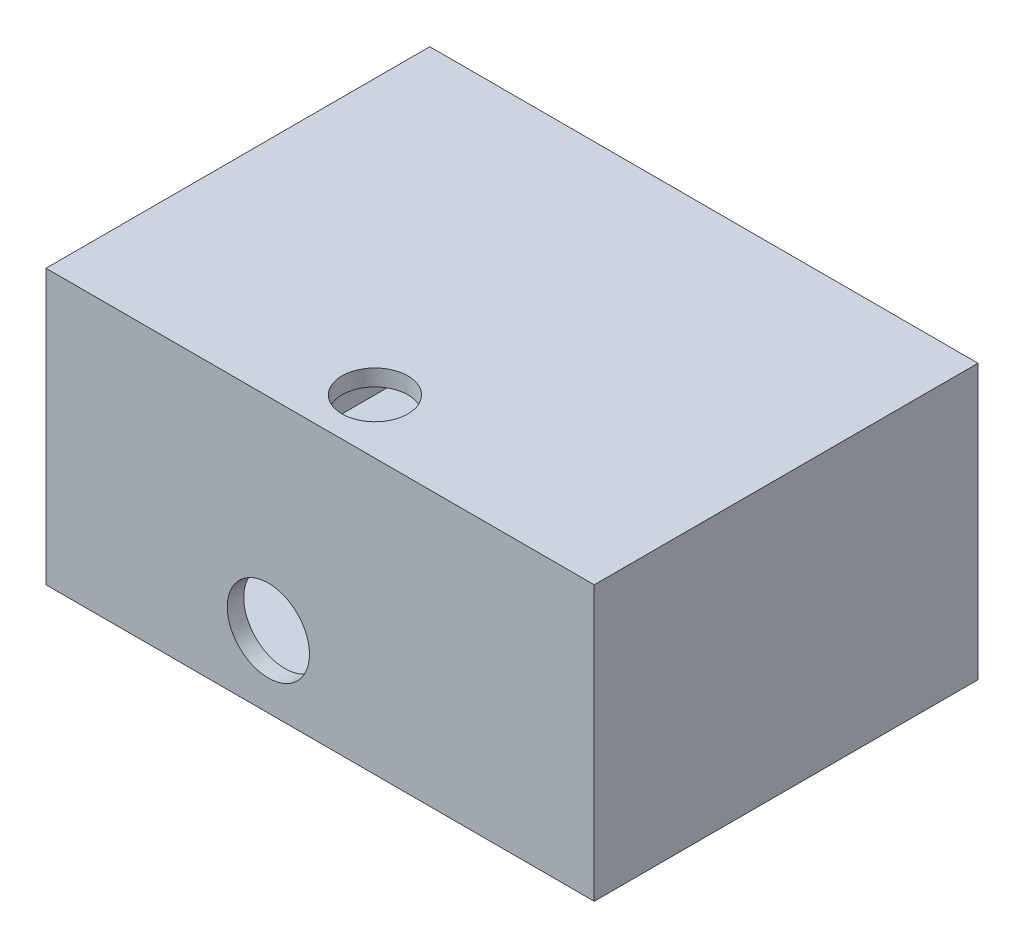
ISO-10303-21;
HEADER;
FILE_DESCRIPTION(('STEP AP214'),'2;1');
FILE_NAME('part.step','',(''),(''),'','','');
FILE_SCHEMA(('AUTOMOTIVE_DESIGN { 1 0 10303 214 1 1 1 1 }'));
ENDSEC;
DATA;
#1=APPLICATION_CONTEXT('core data for automotive mechanical design processes');
#2=APPLICATION_PROTOCOL_DEFINITION('international standard','automotive_design',2000,#1);
#3=PRODUCT_CONTEXT('',#1,'mechanical');
#4=PRODUCT('Part','Part','',(#3));
#5=PRODUCT_RELATED_PRODUCT_CATEGORY('part','',(#4));
#6=PRODUCT_DEFINITION_FORMATION('','',#4);
#7=PRODUCT_DEFINITION_CONTEXT('part definition',#1,'design');
#8=PRODUCT_DEFINITION('design','',#6,#7);
#9=PRODUCT_DEFINITION_SHAPE('','',#8);
#10=(LENGTH_UNIT() NAMED_UNIT(*) SI_UNIT(.MILLI.,.METRE.));
#11=(NAMED_UNIT(*) PLANE_ANGLE_UNIT() SI_UNIT($,.RADIAN.));
#12=(NAMED_UNIT(*) SI_UNIT($,.STERADIAN.) SOLID_ANGLE_UNIT());
#13=UNCERTAINTY_MEASURE_WITH_UNIT(LENGTH_MEASURE(1.E-05),#10,'distance_accuracy_value','');
#14=(GEOMETRIC_REPRESENTATION_CONTEXT(3) GLOBAL_UNCERTAINTY_ASSIGNED_CONTEXT((#13)) GLOBAL_UNIT_ASSIGNED_CONTEXT((#10,
#11,#12)) REPRESENTATION_CONTEXT('',''));
#15=CARTESIAN_POINT('',(0.,0.,0.));
#16=DIRECTION('',(0.,0.,1.));
#17=DIRECTION('',(1.,0.,0.));
#18=AXIS2_PLACEMENT_3D('',#15,#16,#17);
#19=CARTESIAN_POINT('',(-50.,-22.,70.));
#20=DIRECTION('',(0.,1.,0.));
#21=DIRECTION('',(0.,0.,1.));
#22=AXIS2_PLACEMENT_3D('',#19,#20,#21);
#23=PLANE('',#22);
#24=DIRECTION('',(1.,0.,0.));
#25=VECTOR('',#24,1.);
#26=CARTESIAN_POINT('',(-50.,-22.,3.));
#27=LINE('',#26,#25);
#28=CARTESIAN_POINT('',(-47.,-22.,3.));
#29=VERTEX_POINT('',#28);
#30=CARTESIAN_POINT('',(47.,-22.,3.));
#31=VERTEX_POINT('',#30);
#32=EDGE_CURVE('E143',#29,#31,#27,.T.);
#33=ORIENTED_EDGE('',*,*,#32,.F.);
#34=DIRECTION('',(0.,0.,-1.));
#35=VECTOR('',#34,1.);
#36=CARTESIAN_POINT('',(-47.,-22.,70.));
#37=LINE('',#36,#35);
#38=CARTESIAN_POINT('',(-47.,-22.,67.));
#39=VERTEX_POINT('',#38);
#40=EDGE_CURVE('E164',#39,#29,#37,.T.);
#41=ORIENTED_EDGE('',*,*,#40,.F.);
#42=DIRECTION('',(1.,0.,0.));
#43=VECTOR('',#42,1.);
#44=CARTESIAN_POINT('',(-50.,-22.,67.));
#45=LINE('',#44,#43);
#46=CARTESIAN_POINT('',(47.,-22.,67.));
#47=VERTEX_POINT('',#46);
#48=EDGE_CURVE('E135',#39,#47,#45,.T.);
#49=ORIENTED_EDGE('',*,*,#48,.T.);
#50=DIRECTION('',(0.,0.,-1.));
#51=VECTOR('',#50,1.);
#52=CARTESIAN_POINT('',(47.,-22.,70.));
#53=LINE('',#52,#51);
#54=EDGE_CURVE('E141',#47,#31,#53,.T.);
#55=ORIENTED_EDGE('',*,*,#54,.T.);
#56=EDGE_LOOP('',(#33,#41,#49,#55));
#57=FACE_BOUND('',#56,.T.);
#58=ADVANCED_FACE('F41',(#57),#23,.T.);
#59=CARTESIAN_POINT('',(0.,0.,67.));
#60=DIRECTION('',(0.,0.,1.));
#61=DIRECTION('',(1.,0.,0.));
#62=AXIS2_PLACEMENT_3D('',#59,#60,#61);
#63=PLANE('',#62);
#64=CARTESIAN_POINT('',(-9.44,-11.95,67.));
#65=DIRECTION('',(0.,0.,1.));
#66=DIRECTION('',(1.,0.,0.));
#67=AXIS2_PLACEMENT_3D('',#64,#65,#66);
#68=CIRCLE('',#67,7.5);
#69=CARTESIAN_POINT('',(-1.94,-11.95,67.));
#70=VERTEX_POINT('',#69);
#71=EDGE_CURVE('E263',#70,#70,#68,.T.);
#72=ORIENTED_EDGE('',*,*,#71,.T.);
#73=EDGE_LOOP('',(#72));
#74=FACE_BOUND('',#73,.T.);
#75=DIRECTION('',(-1.,0.,0.));
#76=VECTOR('',#75,1.);
#77=CARTESIAN_POINT('',(50.,22.,67.));
#78=LINE('',#77,#76);
#79=CARTESIAN_POINT('',(47.,22.,67.));
#80=VERTEX_POINT('',#79);
#81=CARTESIAN_POINT('',(-47.,22.,67.));
#82=VERTEX_POINT('',#81);
#83=EDGE_CURVE('E114',#80,#82,#78,.T.);
#84=ORIENTED_EDGE('',*,*,#83,.F.);
#85=DIRECTION('',(0.,1.,0.));
#86=VECTOR('',#85,1.);
#87=CARTESIAN_POINT('',(47.,25.,67.));
#88=LINE('',#87,#86);
#89=EDGE_CURVE('E137',#47,#80,#88,.T.);
#90=ORIENTED_EDGE('',*,*,#89,.F.);
#91=ORIENTED_EDGE('',*,*,#48,.F.);
#92=DIRECTION('',(0.,-1.,0.));
#93=VECTOR('',#92,1.);
#94=CARTESIAN_POINT('',(-47.,25.,67.));
#95=LINE('',#94,#93);
#96=EDGE_CURVE('E128',#82,#39,#95,.T.);
#97=ORIENTED_EDGE('',*,*,#96,.F.);
#98=EDGE_LOOP('',(#84,#90,#91,#97));
#99=FACE_BOUND('',#98,.T.);
#100=ADVANCED_FACE('F134',(#74,#99),#63,.F.);
#101=CARTESIAN_POINT('',(0.,0.,3.));
#102=DIRECTION('',(0.,0.,1.));
#103=DIRECTION('',(1.,0.,0.));
#104=AXIS2_PLACEMENT_3D('',#101,#102,#103);
#105=PLANE('',#104);
#106=DIRECTION('',(0.,1.,0.));
#107=VECTOR('',#106,1.);
#108=CARTESIAN_POINT('',(47.,25.,3.));
#109=LINE('',#108,#107);
#110=CARTESIAN_POINT('',(47.,22.,3.));
#111=VERTEX_POINT('',#110);
#112=EDGE_CURVE('E229',#31,#111,#109,.T.);
#113=ORIENTED_EDGE('',*,*,#112,.T.);
#114=DIRECTION('',(-1.,0.,0.));
#115=VECTOR('',#114,1.);
#116=CARTESIAN_POINT('',(0.,22.,3.));
#117=LINE('',#116,#115);
#118=CARTESIAN_POINT('',(-47.,22.,3.));
#119=VERTEX_POINT('',#118);
#120=EDGE_CURVE('E11',#111,#119,#117,.T.);
#121=ORIENTED_EDGE('',*,*,#120,.T.);
#122=DIRECTION('',(0.,-1.,0.));
#123=VECTOR('',#122,1.);
#124=CARTESIAN_POINT('',(-47.,25.,3.));
#125=LINE('',#124,#123);
#126=EDGE_CURVE('E130',#119,#29,#125,.T.);
#127=ORIENTED_EDGE('',*,*,#126,.T.);
#128=ORIENTED_EDGE('',*,*,#32,.T.);
#129=EDGE_LOOP('',(#113,#121,#127,#128));
#130=FACE_BOUND('',#129,.T.);
#131=ADVANCED_FACE('F215',(#130),#105,.T.);
#132=CARTESIAN_POINT('',(-47.,25.,70.));
#133=DIRECTION('',(1.,0.,0.));
#134=DIRECTION('',(0.,1.,0.));
#135=AXIS2_PLACEMENT_3D('',#132,#133,#134);
#136=PLANE('',#135);
#137=ORIENTED_EDGE('',*,*,#126,.F.);
#138=DIRECTION('',(0.,0.,-1.));
#139=VECTOR('',#138,1.);
#140=CARTESIAN_POINT('',(-47.,22.,67.));
#141=LINE('',#140,#139);
#142=EDGE_CURVE('E58',#82,#119,#141,.T.);
#143=ORIENTED_EDGE('',*,*,#142,.F.);
#144=ORIENTED_EDGE('',*,*,#96,.T.);
#145=ORIENTED_EDGE('',*,*,#40,.T.);
#146=EDGE_LOOP('',(#137,#143,#144,#145));
#147=FACE_BOUND('',#146,.T.);
#148=ADVANCED_FACE('F126',(#147),#136,.T.);
#149=CARTESIAN_POINT('',(47.,25.,70.));
#150=DIRECTION('',(-1.,0.,0.));
#151=DIRECTION('',(0.,-1.,0.));
#152=AXIS2_PLACEMENT_3D('',#149,#150,#151);
#153=PLANE('',#152);
#154=ORIENTED_EDGE('',*,*,#89,.T.);
#155=DIRECTION('',(0.,0.,-1.));
#156=VECTOR('',#155,1.);
#157=CARTESIAN_POINT('',(47.,22.,70.));
#158=LINE('',#157,#156);
#159=EDGE_CURVE('E117',#80,#111,#158,.T.);
#160=ORIENTED_EDGE('',*,*,#159,.T.);
#161=ORIENTED_EDGE('',*,*,#112,.F.);
#162=ORIENTED_EDGE('',*,*,#54,.F.);
#163=EDGE_LOOP('',(#154,#160,#161,#162));
#164=FACE_BOUND('',#163,.T.);
#165=ADVANCED_FACE('F226',(#164),#153,.T.);
#166=CARTESIAN_POINT('',(50.,22.,67.));
#167=DIRECTION('',(0.,1.,0.));
#168=DIRECTION('',(-1.,0.,0.));
#169=AXIS2_PLACEMENT_3D('',#166,#167,#168);
#170=PLANE('',#169);
#171=CARTESIAN_POINT('',(0.,22.,60.));
#172=DIRECTION('',(0.,1.,0.));
#173=DIRECTION('',(-1.,0.,0.));
#174=AXIS2_PLACEMENT_3D('',#171,#172,#173);
#175=CIRCLE('',#174,6.015);
#176=CARTESIAN_POINT('',(-6.015,22.,60.));
#177=VERTEX_POINT('',#176);
#178=EDGE_CURVE('E45',#177,#177,#175,.T.);
#179=ORIENTED_EDGE('',*,*,#178,.T.);
#180=EDGE_LOOP('',(#179));
#181=FACE_BOUND('',#180,.T.);
#182=ORIENTED_EDGE('',*,*,#159,.F.);
#183=ORIENTED_EDGE('',*,*,#83,.T.);
#184=ORIENTED_EDGE('',*,*,#142,.T.);
#185=ORIENTED_EDGE('',*,*,#120,.F.);
#186=EDGE_LOOP('',(#182,#183,#184,#185));
#187=FACE_BOUND('',#186,.T.);
#188=ADVANCED_FACE('F115',(#181,#187),#170,.F.);
#189=CARTESIAN_POINT('',(0.,20.,60.));
#190=DIRECTION('',(0.,1.,0.));
#191=DIRECTION('',(0.,0.,1.));
#192=AXIS2_PLACEMENT_3D('',#189,#190,#191);
#193=CYLINDRICAL_SURFACE('',#192,6.015);
#194=CARTESIAN_POINT('',(0.,25.,60.));
#195=DIRECTION('',(0.,1.,0.));
#196=DIRECTION('',(0.,0.,1.));
#197=AXIS2_PLACEMENT_3D('',#194,#195,#196);
#198=CIRCLE('',#197,6.015);
#199=CARTESIAN_POINT('',(0.,25.,66.015));
#200=VERTEX_POINT('',#199);
#201=EDGE_CURVE('E265',#200,#200,#198,.T.);
#202=ORIENTED_EDGE('',*,*,#201,.T.);
#203=EDGE_LOOP('',(#202));
#204=FACE_BOUND('',#203,.T.);
#205=ORIENTED_EDGE('',*,*,#178,.F.);
#206=EDGE_LOOP('',(#205));
#207=FACE_BOUND('',#206,.T.);
#208=ADVANCED_FACE('F247',(#204,#207),#193,.F.);
#209=CARTESIAN_POINT('',(-50.,25.,70.));
#210=DIRECTION('',(0.,-1.,0.));
#211=DIRECTION('',(0.,0.,-1.));
#212=AXIS2_PLACEMENT_3D('',#209,#210,#211);
#213=PLANE('',#212);
#214=ORIENTED_EDGE('',*,*,#201,.F.);
#215=EDGE_LOOP('',(#214));
#216=FACE_BOUND('',#215,.T.);
#217=DIRECTION('',(0.,0.,-1.));
#218=VECTOR('',#217,1.);
#219=CARTESIAN_POINT('',(50.,25.,70.));
#220=LINE('',#219,#218);
#221=CARTESIAN_POINT('',(50.,25.,70.));
#222=VERTEX_POINT('',#221);
#223=CARTESIAN_POINT('',(50.,25.,0.));
#224=VERTEX_POINT('',#223);
#225=EDGE_CURVE('E51',#222,#224,#220,.T.);
#226=ORIENTED_EDGE('',*,*,#225,.T.);
#227=DIRECTION('',(-1.,0.,0.));
#228=VECTOR('',#227,1.);
#229=CARTESIAN_POINT('',(-50.,25.,0.));
#230=LINE('',#229,#228);
#231=CARTESIAN_POINT('',(-50.,25.,0.));
#232=VERTEX_POINT('',#231);
#233=EDGE_CURVE('E163',#224,#232,#230,.T.);
#234=ORIENTED_EDGE('',*,*,#233,.T.);
#235=DIRECTION('',(0.,0.,-1.));
#236=VECTOR('',#235,1.);
#237=CARTESIAN_POINT('',(-50.,25.,70.));
#238=LINE('',#237,#236);
#239=CARTESIAN_POINT('',(-50.,25.,70.));
#240=VERTEX_POINT('',#239);
#241=EDGE_CURVE('E177',#240,#232,#238,.T.);
#242=ORIENTED_EDGE('',*,*,#241,.F.);
#243=DIRECTION('',(-1.,0.,0.));
#244=VECTOR('',#243,1.);
#245=CARTESIAN_POINT('',(-50.,25.,70.));
#246=LINE('',#245,#244);
#247=EDGE_CURVE('E94',#222,#240,#246,.T.);
#248=ORIENTED_EDGE('',*,*,#247,.F.);
#249=EDGE_LOOP('',(#226,#234,#242,#248));
#250=FACE_BOUND('',#249,.T.);
#251=ADVANCED_FACE('F184',(#216,#250),#213,.F.);
#252=CARTESIAN_POINT('',(50.,25.,70.));
#253=DIRECTION('',(-1.,0.,0.));
#254=DIRECTION('',(0.,-1.,0.));
#255=AXIS2_PLACEMENT_3D('',#252,#253,#254);
#256=PLANE('',#255);
#257=DIRECTION('',(0.,1.,0.));
#258=VECTOR('',#257,1.);
#259=CARTESIAN_POINT('',(50.,25.,0.));
#260=LINE('',#259,#258);
#261=CARTESIAN_POINT('',(50.,-25.,0.));
#262=VERTEX_POINT('',#261);
#263=EDGE_CURVE('E159',#262,#224,#260,.T.);
#264=ORIENTED_EDGE('',*,*,#263,.T.);
#265=ORIENTED_EDGE('',*,*,#225,.F.);
#266=DIRECTION('',(0.,1.,0.));
#267=VECTOR('',#266,1.);
#268=CARTESIAN_POINT('',(50.,25.,70.));
#269=LINE('',#268,#267);
#270=CARTESIAN_POINT('',(50.,-25.,70.));
#271=VERTEX_POINT('',#270);
#272=EDGE_CURVE('E148',#271,#222,#269,.T.);
#273=ORIENTED_EDGE('',*,*,#272,.F.);
#274=DIRECTION('',(0.,0.,-1.));
#275=VECTOR('',#274,1.);
#276=CARTESIAN_POINT('',(50.,-25.,70.));
#277=LINE('',#276,#275);
#278=EDGE_CURVE('E158',#271,#262,#277,.T.);
#279=ORIENTED_EDGE('',*,*,#278,.T.);
#280=EDGE_LOOP('',(#264,#265,#273,#279));
#281=FACE_BOUND('',#280,.T.);
#282=ADVANCED_FACE('F43',(#281),#256,.F.);
#283=CARTESIAN_POINT('',(-50.,25.,70.));
#284=DIRECTION('',(1.,0.,0.));
#285=DIRECTION('',(0.,1.,0.));
#286=AXIS2_PLACEMENT_3D('',#283,#284,#285);
#287=PLANE('',#286);
#288=DIRECTION('',(0.,-1.,0.));
#289=VECTOR('',#288,1.);
#290=CARTESIAN_POINT('',(-50.,25.,0.));
#291=LINE('',#290,#289);
#292=CARTESIAN_POINT('',(-50.,-25.,0.));
#293=VERTEX_POINT('',#292);
#294=EDGE_CURVE('E167',#232,#293,#291,.T.);
#295=ORIENTED_EDGE('',*,*,#294,.T.);
#296=DIRECTION('',(0.,0.,-1.));
#297=VECTOR('',#296,1.);
#298=CARTESIAN_POINT('',(-50.,-25.,70.));
#299=LINE('',#298,#297);
#300=CARTESIAN_POINT('',(-50.,-25.,70.));
#301=VERTEX_POINT('',#300);
#302=EDGE_CURVE('E174',#301,#293,#299,.T.);
#303=ORIENTED_EDGE('',*,*,#302,.F.);
#304=DIRECTION('',(0.,-1.,0.));
#305=VECTOR('',#304,1.);
#306=CARTESIAN_POINT('',(-50.,25.,70.));
#307=LINE('',#306,#305);
#308=EDGE_CURVE('E153',#240,#301,#307,.T.);
#309=ORIENTED_EDGE('',*,*,#308,.F.);
#310=ORIENTED_EDGE('',*,*,#241,.T.);
#311=EDGE_LOOP('',(#295,#303,#309,#310));
#312=FACE_BOUND('',#311,.T.);
#313=ADVANCED_FACE('F195',(#312),#287,.F.);
#314=CARTESIAN_POINT('',(-50.,-25.,70.));
#315=DIRECTION('',(0.,1.,0.));
#316=DIRECTION('',(0.,0.,1.));
#317=AXIS2_PLACEMENT_3D('',#314,#315,#316);
#318=PLANE('',#317);
#319=DIRECTION('',(1.,0.,0.));
#320=VECTOR('',#319,1.);
#321=CARTESIAN_POINT('',(-50.,-25.,0.));
#322=LINE('',#321,#320);
#323=EDGE_CURVE('E87',#293,#262,#322,.T.);
#324=ORIENTED_EDGE('',*,*,#323,.T.);
#325=ORIENTED_EDGE('',*,*,#278,.F.);
#326=DIRECTION('',(1.,0.,0.));
#327=VECTOR('',#326,1.);
#328=CARTESIAN_POINT('',(-50.,-25.,70.));
#329=LINE('',#328,#327);
#330=EDGE_CURVE('E66',#301,#271,#329,.T.);
#331=ORIENTED_EDGE('',*,*,#330,.F.);
#332=ORIENTED_EDGE('',*,*,#302,.T.);
#333=EDGE_LOOP('',(#324,#325,#331,#332));
#334=FACE_BOUND('',#333,.T.);
#335=ADVANCED_FACE('F191',(#334),#318,.F.);
#336=CARTESIAN_POINT('',(0.,0.,70.));
#337=DIRECTION('',(0.,0.,1.));
#338=DIRECTION('',(1.,0.,0.));
#339=AXIS2_PLACEMENT_3D('',#336,#337,#338);
#340=PLANE('',#339);
#341=CARTESIAN_POINT('',(-9.44,-11.95,70.));
#342=DIRECTION('',(0.,0.,1.));
#343=DIRECTION('',(1.,0.,0.));
#344=AXIS2_PLACEMENT_3D('',#341,#342,#343);
#345=CIRCLE('',#344,7.5);
#346=CARTESIAN_POINT('',(-1.94,-11.95,70.));
#347=VERTEX_POINT('',#346);
#348=EDGE_CURVE('E260',#347,#347,#345,.T.);
#349=ORIENTED_EDGE('',*,*,#348,.F.);
#350=EDGE_LOOP('',(#349));
#351=FACE_BOUND('',#350,.T.);
#352=ORIENTED_EDGE('',*,*,#272,.T.);
#353=ORIENTED_EDGE('',*,*,#247,.T.);
#354=ORIENTED_EDGE('',*,*,#308,.T.);
#355=ORIENTED_EDGE('',*,*,#330,.T.);
#356=EDGE_LOOP('',(#352,#353,#354,#355));
#357=FACE_BOUND('',#356,.T.);
#358=ADVANCED_FACE('F196',(#351,#357),#340,.T.);
#359=CARTESIAN_POINT('',(0.,0.,0.));
#360=DIRECTION('',(0.,0.,1.));
#361=DIRECTION('',(1.,0.,0.));
#362=AXIS2_PLACEMENT_3D('',#359,#360,#361);
#363=PLANE('',#362);
#364=ORIENTED_EDGE('',*,*,#263,.F.);
#365=ORIENTED_EDGE('',*,*,#323,.F.);
#366=ORIENTED_EDGE('',*,*,#294,.F.);
#367=ORIENTED_EDGE('',*,*,#233,.F.);
#368=EDGE_LOOP('',(#364,#365,#366,#367));
#369=FACE_BOUND('',#368,.T.);
#370=ADVANCED_FACE('F190',(#369),#363,.F.);
#371=CARTESIAN_POINT('',(-9.44,-11.95,60.));
#372=DIRECTION('',(0.,0.,1.));
#373=DIRECTION('',(1.,0.,0.));
#374=AXIS2_PLACEMENT_3D('',#371,#372,#373);
#375=CYLINDRICAL_SURFACE('',#374,7.5);
#376=ORIENTED_EDGE('',*,*,#348,.T.);
#377=EDGE_LOOP('',(#376));
#378=FACE_BOUND('',#377,.T.);
#379=ORIENTED_EDGE('',*,*,#71,.F.);
#380=EDGE_LOOP('',(#379));
#381=FACE_BOUND('',#380,.T.);
#382=ADVANCED_FACE('F204',(#378,#381),#375,.F.);
#383=CLOSED_SHELL('',(#58,#100,#131,#148,#165,#188,#208,#251,#282,#313,#335,#358,#370,#382));
#384=MANIFOLD_SOLID_BREP('B2',#383);
#385=ADVANCED_BREP_SHAPE_REPRESENTATION('',(#18,#384),#14);
#386=SHAPE_DEFINITION_REPRESENTATION(#9,#385);
ENDSEC;
END-ISO-10303-21;
